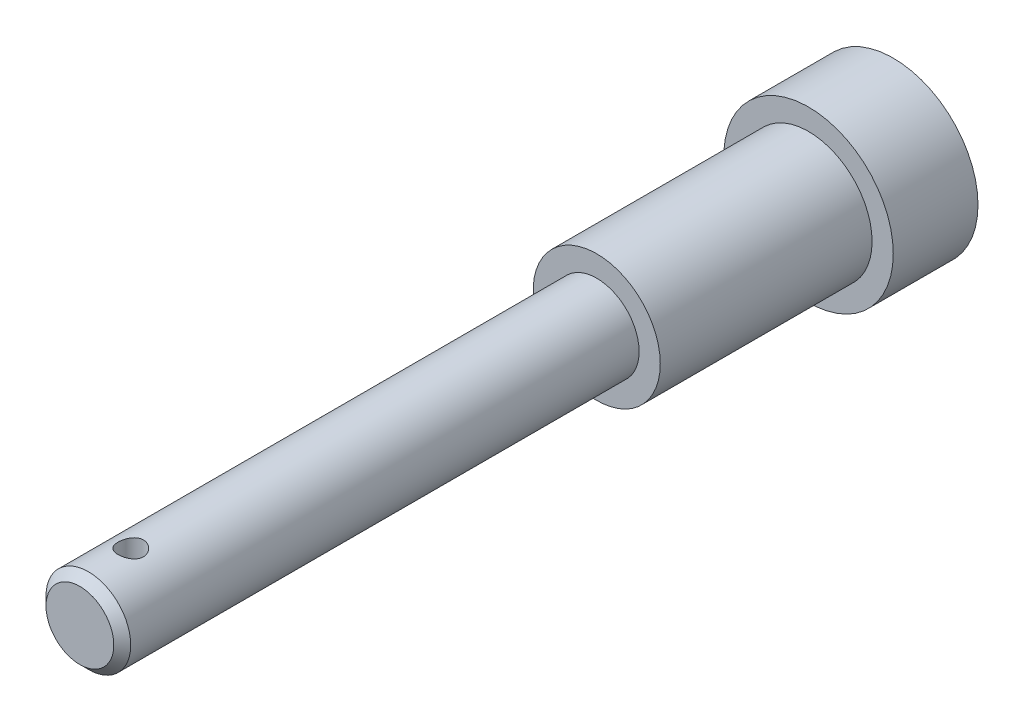
ISO-10303-21;
HEADER;
FILE_DESCRIPTION(('STEP AP214'),'2;1');
FILE_NAME('part.step','',(''),(''),'','','');
FILE_SCHEMA(('AUTOMOTIVE_DESIGN { 1 0 10303 214 1 1 1 1 }'));
ENDSEC;
DATA;
#1=APPLICATION_CONTEXT('core data for automotive mechanical design processes');
#2=APPLICATION_PROTOCOL_DEFINITION('international standard','automotive_design',2000,#1);
#3=PRODUCT_CONTEXT('',#1,'mechanical');
#4=PRODUCT('Part','Part','',(#3));
#5=PRODUCT_RELATED_PRODUCT_CATEGORY('part','',(#4));
#6=PRODUCT_DEFINITION_FORMATION('','',#4);
#7=PRODUCT_DEFINITION_CONTEXT('part definition',#1,'design');
#8=PRODUCT_DEFINITION('design','',#6,#7);
#9=PRODUCT_DEFINITION_SHAPE('','',#8);
#10=(LENGTH_UNIT() NAMED_UNIT(*) SI_UNIT(.MILLI.,.METRE.));
#11=(NAMED_UNIT(*) PLANE_ANGLE_UNIT() SI_UNIT($,.RADIAN.));
#12=(NAMED_UNIT(*) SI_UNIT($,.STERADIAN.) SOLID_ANGLE_UNIT());
#13=UNCERTAINTY_MEASURE_WITH_UNIT(LENGTH_MEASURE(1.E-05),#10,'distance_accuracy_value','');
#14=(GEOMETRIC_REPRESENTATION_CONTEXT(3) GLOBAL_UNCERTAINTY_ASSIGNED_CONTEXT((#13)) GLOBAL_UNIT_ASSIGNED_CONTEXT((#10,
#11,#12)) REPRESENTATION_CONTEXT('',''));
#15=CARTESIAN_POINT('',(0.,0.,0.));
#16=DIRECTION('',(0.,0.,1.));
#17=DIRECTION('',(1.,0.,0.));
#18=AXIS2_PLACEMENT_3D('',#15,#16,#17);
#19=CARTESIAN_POINT('',(0.,0.,20.));
#20=DIRECTION('',(0.,0.,-1.));
#21=DIRECTION('',(-1.,0.,0.));
#22=AXIS2_PLACEMENT_3D('',#19,#20,#21);
#23=CYLINDRICAL_SURFACE('',#22,20.);
#24=CARTESIAN_POINT('',(0.,0.,20.));
#25=DIRECTION('',(0.,0.,1.));
#26=DIRECTION('',(1.,0.,0.));
#27=AXIS2_PLACEMENT_3D('',#24,#25,#26);
#28=CIRCLE('',#27,20.);
#29=CARTESIAN_POINT('',(20.,0.,20.));
#30=VERTEX_POINT('',#29);
#31=EDGE_CURVE('E10',#30,#30,#28,.T.);
#32=ORIENTED_EDGE('',*,*,#31,.F.);
#33=EDGE_LOOP('',(#32));
#34=FACE_BOUND('',#33,.T.);
#35=CARTESIAN_POINT('',(0.,0.,0.));
#36=DIRECTION('',(0.,0.,1.));
#37=DIRECTION('',(1.,0.,0.));
#38=AXIS2_PLACEMENT_3D('',#35,#36,#37);
#39=CIRCLE('',#38,20.);
#40=CARTESIAN_POINT('',(20.,0.,0.));
#41=VERTEX_POINT('',#40);
#42=EDGE_CURVE('E42',#41,#41,#39,.T.);
#43=ORIENTED_EDGE('',*,*,#42,.T.);
#44=EDGE_LOOP('',(#43));
#45=FACE_BOUND('',#44,.T.);
#46=ADVANCED_FACE('F31',(#34,#45),#23,.T.);
#47=CARTESIAN_POINT('',(0.,0.,20.));
#48=DIRECTION('',(0.,0.,1.));
#49=DIRECTION('',(1.,0.,0.));
#50=AXIS2_PLACEMENT_3D('',#47,#48,#49);
#51=PLANE('',#50);
#52=CARTESIAN_POINT('',(0.,0.,20.));
#53=DIRECTION('',(0.,0.,1.));
#54=DIRECTION('',(1.,0.,0.));
#55=AXIS2_PLACEMENT_3D('',#52,#53,#54);
#56=CIRCLE('',#55,15.);
#57=CARTESIAN_POINT('',(15.,0.,20.));
#58=VERTEX_POINT('',#57);
#59=EDGE_CURVE('E50',#58,#58,#56,.T.);
#60=ORIENTED_EDGE('',*,*,#59,.F.);
#61=EDGE_LOOP('',(#60));
#62=FACE_BOUND('',#61,.T.);
#63=ORIENTED_EDGE('',*,*,#31,.T.);
#64=EDGE_LOOP('',(#63));
#65=FACE_BOUND('',#64,.T.);
#66=ADVANCED_FACE('F79',(#62,#65),#51,.T.);
#67=CARTESIAN_POINT('',(0.,0.,0.));
#68=DIRECTION('',(0.,0.,1.));
#69=DIRECTION('',(1.,0.,0.));
#70=AXIS2_PLACEMENT_3D('',#67,#68,#69);
#71=PLANE('',#70);
#72=ORIENTED_EDGE('',*,*,#42,.F.);
#73=EDGE_LOOP('',(#72));
#74=FACE_BOUND('',#73,.T.);
#75=ADVANCED_FACE('F84',(#74),#71,.F.);
#76=CARTESIAN_POINT('',(0.,0.,70.));
#77=DIRECTION('',(0.,0.,-1.));
#78=DIRECTION('',(-1.,0.,0.));
#79=AXIS2_PLACEMENT_3D('',#76,#77,#78);
#80=CYLINDRICAL_SURFACE('',#79,15.);
#81=CARTESIAN_POINT('',(0.,0.,70.));
#82=DIRECTION('',(0.,0.,1.));
#83=DIRECTION('',(1.,0.,0.));
#84=AXIS2_PLACEMENT_3D('',#81,#82,#83);
#85=CIRCLE('',#84,15.);
#86=CARTESIAN_POINT('',(15.,0.,70.));
#87=VERTEX_POINT('',#86);
#88=EDGE_CURVE('E47',#87,#87,#85,.T.);
#89=ORIENTED_EDGE('',*,*,#88,.F.);
#90=EDGE_LOOP('',(#89));
#91=FACE_BOUND('',#90,.T.);
#92=ORIENTED_EDGE('',*,*,#59,.T.);
#93=EDGE_LOOP('',(#92));
#94=FACE_BOUND('',#93,.T.);
#95=ADVANCED_FACE('F91',(#91,#94),#80,.T.);
#96=CARTESIAN_POINT('',(0.,0.,70.));
#97=DIRECTION('',(0.,0.,1.));
#98=DIRECTION('',(1.,0.,0.));
#99=AXIS2_PLACEMENT_3D('',#96,#97,#98);
#100=PLANE('',#99);
#101=CARTESIAN_POINT('',(0.,0.,70.));
#102=DIRECTION('',(0.,0.,1.));
#103=DIRECTION('',(1.,0.,0.));
#104=AXIS2_PLACEMENT_3D('',#101,#102,#103);
#105=CIRCLE('',#104,10.);
#106=CARTESIAN_POINT('',(10.,0.,70.));
#107=VERTEX_POINT('',#106);
#108=EDGE_CURVE('E104',#107,#107,#105,.T.);
#109=ORIENTED_EDGE('',*,*,#108,.F.);
#110=EDGE_LOOP('',(#109));
#111=FACE_BOUND('',#110,.T.);
#112=ORIENTED_EDGE('',*,*,#88,.T.);
#113=EDGE_LOOP('',(#112));
#114=FACE_BOUND('',#113,.T.);
#115=ADVANCED_FACE('F75',(#111,#114),#100,.T.);
#116=CARTESIAN_POINT('',(0.,0.,190.));
#117=DIRECTION('',(0.,0.,-1.));
#118=DIRECTION('',(-1.,0.,0.));
#119=AXIS2_PLACEMENT_3D('',#116,#117,#118);
#120=CYLINDRICAL_SURFACE('',#119,10.);
#121=CARTESIAN_POINT('',(0.,-10.,183.));
#122=CARTESIAN_POINT('',(0.164577225506599,-9.999998585011,182.99999800503));
#123=CARTESIAN_POINT('',(0.329174636703055,-9.99589831387907,182.986412272752));
#124=CARTESIAN_POINT('',(0.653576250609759,-9.97994211187382,182.932557291556));
#125=CARTESIAN_POINT('',(0.813379008822841,-9.96808386779384,182.892280083953));
#126=CARTESIAN_POINT('',(1.12346541550905,-9.93791105003673,182.786507966179));
#127=CARTESIAN_POINT('',(1.27376272879074,-9.91960600500851,182.721050260762));
#128=CARTESIAN_POINT('',(1.56124836210626,-9.87844218475291,182.566927813888));
#129=CARTESIAN_POINT('',(1.69843493493934,-9.85558280384133,182.478259985209));
#130=CARTESIAN_POINT('',(1.95974359436749,-9.80701474385548,182.277551985055));
#131=CARTESIAN_POINT('',(2.08343614248868,-9.78124767314073,182.164966748228));
#132=CARTESIAN_POINT('',(2.31049841846647,-9.73011668420884,181.92078154018));
#133=CARTESIAN_POINT('',(2.41386472654881,-9.70475283449003,181.78917837575));
#134=CARTESIAN_POINT('',(2.59960075447415,-9.65668227987544,181.507058493925));
#135=CARTESIAN_POINT('',(2.68144618044426,-9.63404813327749,181.356183078019));
#136=CARTESIAN_POINT('',(2.8184278954952,-9.59487240788062,181.042021491539));
#137=CARTESIAN_POINT('',(2.87357059839946,-9.57832936626621,180.878738312144));
#138=CARTESIAN_POINT('',(2.95403267365304,-9.55381741676868,180.549219467739));
#139=CARTESIAN_POINT('',(2.98014392469355,-9.54562138649067,180.383194512272));
#140=CARTESIAN_POINT('',(3.00427461229344,-9.53805579499535,180.048933687566));
#141=CARTESIAN_POINT('',(3.00230085522157,-9.53868409521142,179.880698363882));
#142=CARTESIAN_POINT('',(2.97093954399624,-9.54849488135555,179.553232182783));
#143=CARTESIAN_POINT('',(2.94254410525371,-9.55736777198281,179.393895499276));
#144=CARTESIAN_POINT('',(2.86074840854112,-9.58216712457248,179.082360427453));
#145=CARTESIAN_POINT('',(2.80734568283282,-9.59809428264701,178.930162745251));
#146=CARTESIAN_POINT('',(2.67632053307364,-9.63545466149946,178.634799300679));
#147=CARTESIAN_POINT('',(2.59837633869285,-9.65696032231904,178.491785832089));
#148=CARTESIAN_POINT('',(2.42070445177366,-9.70301974000129,178.22053595598));
#149=CARTESIAN_POINT('',(2.32097148005177,-9.72757423493982,178.092303141172));
#150=CARTESIAN_POINT('',(2.09762581531093,-9.77822022595875,177.848627618476));
#151=CARTESIAN_POINT('',(1.97318981493395,-9.80433308620996,177.733942671941));
#152=CARTESIAN_POINT('',(1.70652651862794,-9.85424488126517,177.526892031871));
#153=CARTESIAN_POINT('',(1.56429810372179,-9.8780436703682,177.434527743171));
#154=CARTESIAN_POINT('',(1.26471007668562,-9.92086320138941,177.274280155071));
#155=CARTESIAN_POINT('',(1.10725549949591,-9.93985087336628,177.2065649675));
#156=CARTESIAN_POINT('',(0.782490831207046,-9.97067043664444,177.098800819801));
#157=CARTESIAN_POINT('',(0.615183503179171,-9.98250432373999,177.058744142935));
#158=CARTESIAN_POINT('',(0.281904485336671,-9.99736729287077,177.008695644201));
#159=CARTESIAN_POINT('',(0.11610019520238,-10.0006970083558,176.997676828397));
#160=CARTESIAN_POINT('',(-0.214999211646761,-9.99905846483519,177.003138311424));
#161=CARTESIAN_POINT('',(-0.380294393381556,-9.99409131355514,177.019614939303));
#162=CARTESIAN_POINT('',(-0.70180721061939,-9.97661393974325,177.078769222223));
#163=CARTESIAN_POINT('',(-0.858145545228336,-9.96427659598829,177.120846775162));
#164=CARTESIAN_POINT('',(-1.16150927790904,-9.9334869568307,177.229286465556));
#165=CARTESIAN_POINT('',(-1.30853355405116,-9.91503392642188,177.295651522076));
#166=CARTESIAN_POINT('',(-1.5928743789221,-9.87339308702631,177.452506330962));
#167=CARTESIAN_POINT('',(-1.72988765239933,-9.8501056165928,177.543518681896));
#168=CARTESIAN_POINT('',(-1.98704661596029,-9.80146937528705,177.746449508106));
#169=CARTESIAN_POINT('',(-2.10718806471187,-9.7761200886242,177.858373223775));
#170=CARTESIAN_POINT('',(-2.33171489102052,-9.72506343738007,178.104774616739));
#171=CARTESIAN_POINT('',(-2.43536962463001,-9.69937650065513,178.239923751544));
#172=CARTESIAN_POINT('',(-2.61857990144313,-9.65153030477949,178.526255878027));
#173=CARTESIAN_POINT('',(-2.69813607658965,-9.62937095313121,178.677438449116));
#174=CARTESIAN_POINT('',(-2.83034694254316,-9.5913437922631,178.99106498251));
#175=CARTESIAN_POINT('',(-2.88312693874022,-9.57544675673501,179.153452373076));
#176=CARTESIAN_POINT('',(-2.96043461630307,-9.55183188739737,179.48537593786));
#177=CARTESIAN_POINT('',(-2.98497197957849,-9.54411125069387,179.654909641566));
#178=CARTESIAN_POINT('',(-3.0044396896993,-9.53799944941558,179.988723036777));
#179=CARTESIAN_POINT('',(-3.00056110615887,-9.53923294700394,180.152927302099));
#180=CARTESIAN_POINT('',(-2.9661501088861,-9.54998802392188,180.478228206801));
#181=CARTESIAN_POINT('',(-2.93561876249408,-9.55950927135901,180.639324970361));
#182=CARTESIAN_POINT('',(-2.84953777608686,-9.58551527389243,180.951890798263));
#183=CARTESIAN_POINT('',(-2.79430351014248,-9.60191209104934,181.103454574717));
#184=CARTESIAN_POINT('',(-2.66063014242148,-9.63980557805265,181.395284877641));
#185=CARTESIAN_POINT('',(-2.58218659925724,-9.6613032238508,181.535549235283));
#186=CARTESIAN_POINT('',(-2.40097527610177,-9.70795352855338,181.806326233053));
#187=CARTESIAN_POINT('',(-2.29742552185997,-9.7332108032858,181.93629752252));
#188=CARTESIAN_POINT('',(-2.07034869259556,-9.78402640899066,182.177404996616));
#189=CARTESIAN_POINT('',(-1.94681643426899,-9.80958481647543,182.288536278936));
#190=CARTESIAN_POINT('',(-1.67893152436654,-9.85901873141573,182.49204682459));
#191=CARTESIAN_POINT('',(-1.53407577158124,-9.88282319531421,182.583782893711));
#192=CARTESIAN_POINT('',(-1.23028274796706,-9.92521360911553,182.741470339808));
#193=CARTESIAN_POINT('',(-1.0713521059979,-9.94380199862114,182.807433776549));
#194=CARTESIAN_POINT('',(-0.761515425310556,-9.97204349938619,182.905790551305));
#195=CARTESIAN_POINT('',(-0.611573923908464,-9.9824405476214,182.941023345766));
#196=CARTESIAN_POINT('',(-0.307760390461557,-9.9964188898898,182.988127050483));
#197=CARTESIAN_POINT('',(-0.153889019716278,-10.0000013230948,183.00000186541));
#198=CARTESIAN_POINT('',(0.,-10.,183.));
#199=B_SPLINE_CURVE_WITH_KNOTS('',3,(#121,#122,#123,#124,#125,#126,#127,#128,#129,#130,#131,
#132,#133,#134,#135,#136,#137,#138,#139,#140,#141,#142,#143,#144,#145,#146,#147,#148,#149,#150,
#151,#152,#153,#154,#155,#156,#157,#158,#159,#160,#161,#162,#163,#164,#165,#166,#167,#168,#169,
#170,#171,#172,#173,#174,#175,#176,#177,#178,#179,#180,#181,#182,#183,#184,#185,#186,#187,#188,
#189,#190,#191,#192,#193,#194,#195,#196,#197,#198),.UNSPECIFIED.,.T.,.F.,(4,2,2,2,2,2,2,2,2,2,2,
2,2,2,2,2,2,2,2,2,2,2,2,2,2,2,2,2,2,2,2,2,2,2,2,2,2,2,4),(0.,0.493166407225218,
0.986479929691996,1.47906735260174,1.97172032882541,2.47711205896384,2.98258874577266,
3.49942962008217,4.01614629086446,4.51839378713198,5.02051956638177,5.5045203339535,
5.98856887316001,6.47924852894239,6.9700472031711,7.48134208096334,7.99266913062142,
8.50742093763377,9.02202907057615,9.5181761887709,10.0142570710065,10.4991349336465,
10.9840710918746,11.4802261140582,11.9765056400038,12.4908080064564,13.0050968850536,
13.5169562990251,14.0286401892057,14.5190031093854,15.0093463933232,15.4936008081456,
15.9779479511534,16.4799385136898,16.9820594980412,17.4988599232246,18.0154182319959,
18.4766338387004,18.9377723390687),.UNSPECIFIED.);
#200=CARTESIAN_POINT('',(0.,-10.,183.));
#201=VERTEX_POINT('',#200);
#202=EDGE_CURVE('E34',#201,#201,#199,.T.);
#203=ORIENTED_EDGE('',*,*,#202,.T.);
#204=EDGE_LOOP('',(#203));
#205=FACE_BOUND('',#204,.T.);
#206=CARTESIAN_POINT('',(0.,10.,183.));
#207=CARTESIAN_POINT('',(-0.164577225506599,9.999998585011,182.99999800503));
#208=CARTESIAN_POINT('',(-0.329174636703055,9.99589831387907,182.986412272752));
#209=CARTESIAN_POINT('',(-0.653576250609759,9.97994211187382,182.932557291556));
#210=CARTESIAN_POINT('',(-0.813379008822841,9.96808386779384,182.892280083953));
#211=CARTESIAN_POINT('',(-1.12346541550905,9.93791105003673,182.786507966179));
#212=CARTESIAN_POINT('',(-1.27376272879074,9.91960600500851,182.721050260762));
#213=CARTESIAN_POINT('',(-1.56124836210626,9.87844218475291,182.566927813888));
#214=CARTESIAN_POINT('',(-1.69843493493934,9.85558280384133,182.478259985209));
#215=CARTESIAN_POINT('',(-1.95974359436749,9.80701474385548,182.277551985055));
#216=CARTESIAN_POINT('',(-2.08343614248868,9.78124767314073,182.164966748228));
#217=CARTESIAN_POINT('',(-2.31049841846647,9.73011668420884,181.92078154018));
#218=CARTESIAN_POINT('',(-2.41386472654881,9.70475283449003,181.78917837575));
#219=CARTESIAN_POINT('',(-2.59960075447415,9.65668227987544,181.507058493925));
#220=CARTESIAN_POINT('',(-2.68144618044426,9.63404813327749,181.356183078019));
#221=CARTESIAN_POINT('',(-2.8184278954952,9.59487240788062,181.042021491539));
#222=CARTESIAN_POINT('',(-2.87357059839946,9.57832936626621,180.878738312144));
#223=CARTESIAN_POINT('',(-2.95403267365304,9.55381741676868,180.549219467739));
#224=CARTESIAN_POINT('',(-2.98014392469355,9.54562138649067,180.383194512272));
#225=CARTESIAN_POINT('',(-3.00427461229344,9.53805579499535,180.048933687566));
#226=CARTESIAN_POINT('',(-3.00230085522157,9.53868409521142,179.880698363882));
#227=CARTESIAN_POINT('',(-2.97093954399624,9.54849488135555,179.553232182783));
#228=CARTESIAN_POINT('',(-2.94254410525371,9.55736777198281,179.393895499276));
#229=CARTESIAN_POINT('',(-2.86074840854112,9.58216712457248,179.082360427453));
#230=CARTESIAN_POINT('',(-2.80734568283282,9.59809428264701,178.930162745251));
#231=CARTESIAN_POINT('',(-2.67632053307364,9.63545466149946,178.634799300679));
#232=CARTESIAN_POINT('',(-2.59837633869285,9.65696032231904,178.491785832089));
#233=CARTESIAN_POINT('',(-2.42070445177366,9.70301974000129,178.22053595598));
#234=CARTESIAN_POINT('',(-2.32097148005177,9.72757423493982,178.092303141172));
#235=CARTESIAN_POINT('',(-2.09762581531093,9.77822022595875,177.848627618476));
#236=CARTESIAN_POINT('',(-1.97318981493395,9.80433308620996,177.733942671941));
#237=CARTESIAN_POINT('',(-1.70652651862794,9.85424488126517,177.526892031871));
#238=CARTESIAN_POINT('',(-1.56429810372179,9.8780436703682,177.434527743171));
#239=CARTESIAN_POINT('',(-1.26471007668562,9.92086320138941,177.274280155071));
#240=CARTESIAN_POINT('',(-1.10725549949591,9.93985087336628,177.2065649675));
#241=CARTESIAN_POINT('',(-0.782490831207046,9.97067043664444,177.098800819801));
#242=CARTESIAN_POINT('',(-0.615183503179171,9.98250432373999,177.058744142935));
#243=CARTESIAN_POINT('',(-0.281904485336671,9.99736729287077,177.008695644201));
#244=CARTESIAN_POINT('',(-0.11610019520238,10.0006970083558,176.997676828397));
#245=CARTESIAN_POINT('',(0.214999211646761,9.99905846483519,177.003138311424));
#246=CARTESIAN_POINT('',(0.380294393381556,9.99409131355514,177.019614939303));
#247=CARTESIAN_POINT('',(0.70180721061939,9.97661393974325,177.078769222223));
#248=CARTESIAN_POINT('',(0.858145545228336,9.96427659598829,177.120846775162));
#249=CARTESIAN_POINT('',(1.16150927790904,9.9334869568307,177.229286465556));
#250=CARTESIAN_POINT('',(1.30853355405116,9.91503392642188,177.295651522076));
#251=CARTESIAN_POINT('',(1.5928743789221,9.87339308702631,177.452506330962));
#252=CARTESIAN_POINT('',(1.72988765239933,9.8501056165928,177.543518681896));
#253=CARTESIAN_POINT('',(1.98704661596029,9.80146937528705,177.746449508106));
#254=CARTESIAN_POINT('',(2.10718806471187,9.7761200886242,177.858373223775));
#255=CARTESIAN_POINT('',(2.33171489102052,9.72506343738007,178.104774616739));
#256=CARTESIAN_POINT('',(2.43536962463001,9.69937650065513,178.239923751544));
#257=CARTESIAN_POINT('',(2.61857990144313,9.65153030477949,178.526255878027));
#258=CARTESIAN_POINT('',(2.69813607658965,9.62937095313121,178.677438449116));
#259=CARTESIAN_POINT('',(2.83034694254316,9.5913437922631,178.99106498251));
#260=CARTESIAN_POINT('',(2.88312693874022,9.57544675673501,179.153452373076));
#261=CARTESIAN_POINT('',(2.96043461630307,9.55183188739737,179.48537593786));
#262=CARTESIAN_POINT('',(2.98497197957849,9.54411125069387,179.654909641566));
#263=CARTESIAN_POINT('',(3.0044396896993,9.53799944941558,179.988723036777));
#264=CARTESIAN_POINT('',(3.00056110615887,9.53923294700394,180.152927302099));
#265=CARTESIAN_POINT('',(2.9661501088861,9.54998802392188,180.478228206801));
#266=CARTESIAN_POINT('',(2.93561876249408,9.55950927135901,180.639324970361));
#267=CARTESIAN_POINT('',(2.84953777608686,9.58551527389243,180.951890798263));
#268=CARTESIAN_POINT('',(2.79430351014248,9.60191209104934,181.103454574717));
#269=CARTESIAN_POINT('',(2.66063014242148,9.63980557805265,181.395284877641));
#270=CARTESIAN_POINT('',(2.58218659925724,9.6613032238508,181.535549235283));
#271=CARTESIAN_POINT('',(2.40097527610177,9.70795352855338,181.806326233053));
#272=CARTESIAN_POINT('',(2.29742552185997,9.7332108032858,181.93629752252));
#273=CARTESIAN_POINT('',(2.07034869259556,9.78402640899066,182.177404996616));
#274=CARTESIAN_POINT('',(1.94681643426899,9.80958481647543,182.288536278936));
#275=CARTESIAN_POINT('',(1.67893152436654,9.85901873141573,182.49204682459));
#276=CARTESIAN_POINT('',(1.53407577158124,9.88282319531421,182.583782893711));
#277=CARTESIAN_POINT('',(1.23028274796706,9.92521360911553,182.741470339808));
#278=CARTESIAN_POINT('',(1.0713521059979,9.94380199862114,182.807433776549));
#279=CARTESIAN_POINT('',(0.761515425310556,9.97204349938619,182.905790551305));
#280=CARTESIAN_POINT('',(0.611573923908464,9.9824405476214,182.941023345766));
#281=CARTESIAN_POINT('',(0.307760390461557,9.9964188898898,182.988127050483));
#282=CARTESIAN_POINT('',(0.153889019716278,10.0000013230948,183.00000186541));
#283=CARTESIAN_POINT('',(0.,10.,183.));
#284=B_SPLINE_CURVE_WITH_KNOTS('',3,(#206,#207,#208,#209,#210,#211,#212,#213,#214,#215,#216,
#217,#218,#219,#220,#221,#222,#223,#224,#225,#226,#227,#228,#229,#230,#231,#232,#233,#234,#235,
#236,#237,#238,#239,#240,#241,#242,#243,#244,#245,#246,#247,#248,#249,#250,#251,#252,#253,#254,
#255,#256,#257,#258,#259,#260,#261,#262,#263,#264,#265,#266,#267,#268,#269,#270,#271,#272,#273,
#274,#275,#276,#277,#278,#279,#280,#281,#282,#283),.UNSPECIFIED.,.T.,.F.,(4,2,2,2,2,2,2,2,2,2,2,
2,2,2,2,2,2,2,2,2,2,2,2,2,2,2,2,2,2,2,2,2,2,2,2,2,2,2,4),(0.,0.493166407225218,
0.986479929691996,1.47906735260174,1.97172032882541,2.47711205896384,2.98258874577266,
3.49942962008217,4.01614629086446,4.51839378713198,5.02051956638177,5.5045203339535,
5.98856887316001,6.47924852894239,6.9700472031711,7.48134208096334,7.99266913062142,
8.50742093763377,9.02202907057615,9.5181761887709,10.0142570710065,10.4991349336465,
10.9840710918746,11.4802261140582,11.9765056400038,12.4908080064564,13.0050968850536,
13.5169562990251,14.0286401892057,14.5190031093854,15.0093463933232,15.4936008081456,
15.9779479511534,16.4799385136898,16.9820594980412,17.4988599232246,18.0154182319959,
18.4766338387004,18.9377723390687),.UNSPECIFIED.);
#285=CARTESIAN_POINT('',(0.,10.,183.));
#286=VERTEX_POINT('',#285);
#287=EDGE_CURVE('E52',#286,#286,#284,.T.);
#288=ORIENTED_EDGE('',*,*,#287,.T.);
#289=EDGE_LOOP('',(#288));
#290=FACE_BOUND('',#289,.T.);
#291=CARTESIAN_POINT('',(0.,0.,190.));
#292=DIRECTION('',(0.,0.,1.));
#293=DIRECTION('',(1.,0.,0.));
#294=AXIS2_PLACEMENT_3D('',#291,#292,#293);
#295=CIRCLE('',#294,10.);
#296=CARTESIAN_POINT('',(10.,0.,190.));
#297=VERTEX_POINT('',#296);
#298=EDGE_CURVE('E108',#297,#297,#295,.T.);
#299=ORIENTED_EDGE('',*,*,#298,.F.);
#300=EDGE_LOOP('',(#299));
#301=FACE_BOUND('',#300,.T.);
#302=ORIENTED_EDGE('',*,*,#108,.T.);
#303=EDGE_LOOP('',(#302));
#304=FACE_BOUND('',#303,.T.);
#305=ADVANCED_FACE('F56',(#205,#290,#301,#304),#120,.T.);
#306=CARTESIAN_POINT('',(0.,0.,192.));
#307=DIRECTION('',(0.,0.,-1.));
#308=DIRECTION('',(-1.,0.,0.));
#309=AXIS2_PLACEMENT_3D('',#306,#307,#308);
#310=PLANE('',#309);
#311=CARTESIAN_POINT('',(0.,0.,192.));
#312=DIRECTION('',(0.,0.,-1.));
#313=DIRECTION('',(-1.,0.,0.));
#314=AXIS2_PLACEMENT_3D('',#311,#312,#313);
#315=CIRCLE('',#314,7.99999999999999);
#316=CARTESIAN_POINT('',(-7.99999999999999,0.,192.));
#317=VERTEX_POINT('',#316);
#318=EDGE_CURVE('E111',#317,#317,#315,.T.);
#319=ORIENTED_EDGE('',*,*,#318,.F.);
#320=EDGE_LOOP('',(#319));
#321=FACE_BOUND('',#320,.T.);
#322=ADVANCED_FACE('F68',(#321),#310,.F.);
#323=CARTESIAN_POINT('',(0.,0.,192.));
#324=DIRECTION('',(0.,0.,-1.));
#325=DIRECTION('',(-1.,0.,0.));
#326=AXIS2_PLACEMENT_3D('',#323,#324,#325);
#327=CONICAL_SURFACE('',#326,7.99999999999999,0.785398163397451);
#328=ORIENTED_EDGE('',*,*,#298,.T.);
#329=EDGE_LOOP('',(#328));
#330=FACE_BOUND('',#329,.T.);
#331=ORIENTED_EDGE('',*,*,#318,.T.);
#332=EDGE_LOOP('',(#331));
#333=FACE_BOUND('',#332,.T.);
#334=ADVANCED_FACE('F64',(#330,#333),#327,.T.);
#335=CARTESIAN_POINT('',(0.,-22.,180.));
#336=DIRECTION('',(0.,1.,0.));
#337=DIRECTION('',(0.,0.,1.));
#338=AXIS2_PLACEMENT_3D('',#335,#336,#337);
#339=CYLINDRICAL_SURFACE('',#338,3.);
#340=ORIENTED_EDGE('',*,*,#287,.F.);
#341=EDGE_LOOP('',(#340));
#342=FACE_BOUND('',#341,.T.);
#343=ORIENTED_EDGE('',*,*,#202,.F.);
#344=EDGE_LOOP('',(#343));
#345=FACE_BOUND('',#344,.T.);
#346=ADVANCED_FACE('F60',(#342,#345),#339,.F.);
#347=CLOSED_SHELL('',(#46,#66,#75,#95,#115,#305,#322,#334,#346));
#348=MANIFOLD_SOLID_BREP('B2',#347);
#349=ADVANCED_BREP_SHAPE_REPRESENTATION('',(#18,#348),#14);
#350=SHAPE_DEFINITION_REPRESENTATION(#9,#349);
ENDSEC;
END-ISO-10303-21;
